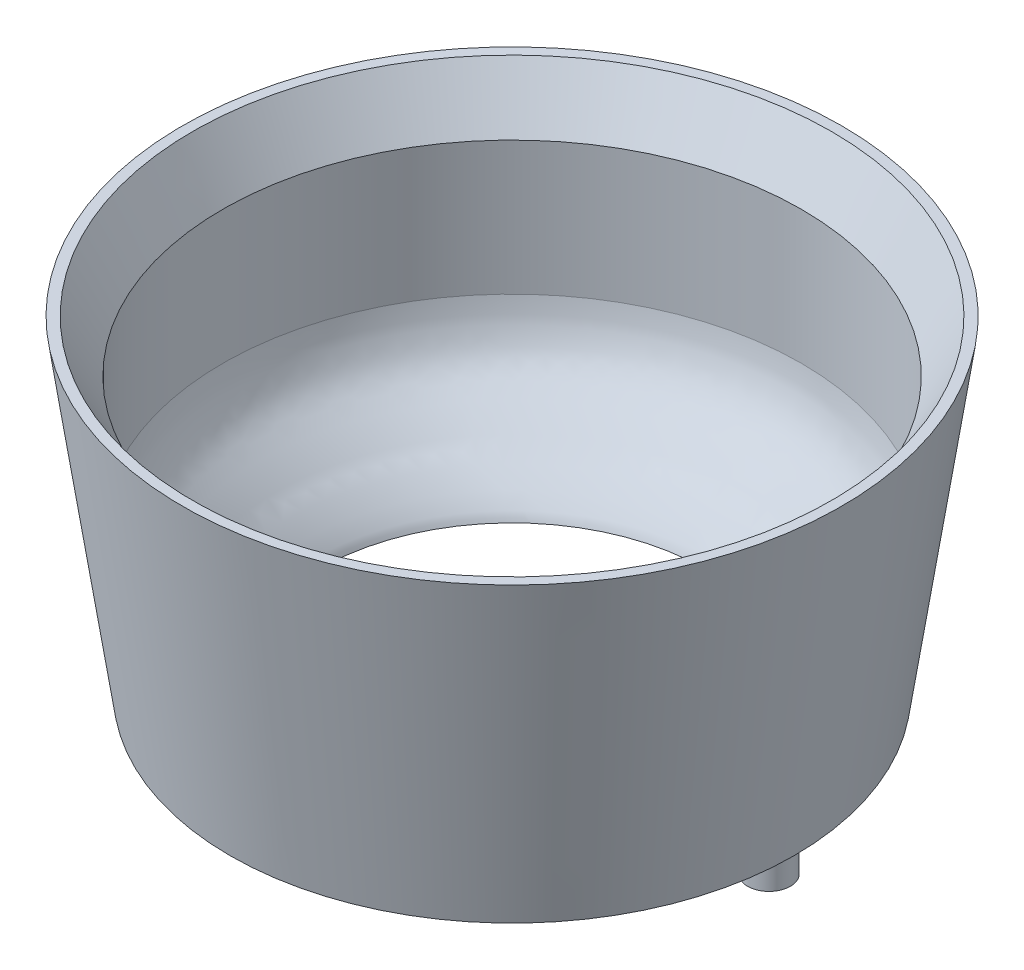
ISO-10303-21;
HEADER;
FILE_DESCRIPTION(('STEP AP214'),'2;1');
FILE_NAME('part.step','',(''),(''),'','','');
FILE_SCHEMA(('AUTOMOTIVE_DESIGN { 1 0 10303 214 1 1 1 1 }'));
ENDSEC;
DATA;
#1=APPLICATION_CONTEXT('core data for automotive mechanical design processes');
#2=APPLICATION_PROTOCOL_DEFINITION('international standard','automotive_design',2000,#1);
#3=PRODUCT_CONTEXT('',#1,'mechanical');
#4=PRODUCT('Part','Part','',(#3));
#5=PRODUCT_RELATED_PRODUCT_CATEGORY('part','',(#4));
#6=PRODUCT_DEFINITION_FORMATION('','',#4);
#7=PRODUCT_DEFINITION_CONTEXT('part definition',#1,'design');
#8=PRODUCT_DEFINITION('design','',#6,#7);
#9=PRODUCT_DEFINITION_SHAPE('','',#8);
#10=(LENGTH_UNIT() NAMED_UNIT(*) SI_UNIT(.MILLI.,.METRE.));
#11=(NAMED_UNIT(*) PLANE_ANGLE_UNIT() SI_UNIT($,.RADIAN.));
#12=(NAMED_UNIT(*) SI_UNIT($,.STERADIAN.) SOLID_ANGLE_UNIT());
#13=UNCERTAINTY_MEASURE_WITH_UNIT(LENGTH_MEASURE(1.E-05),#10,'distance_accuracy_value','');
#14=(GEOMETRIC_REPRESENTATION_CONTEXT(3) GLOBAL_UNCERTAINTY_ASSIGNED_CONTEXT((#13)) GLOBAL_UNIT_ASSIGNED_CONTEXT((#10,
#11,#12)) REPRESENTATION_CONTEXT('',''));
#15=CARTESIAN_POINT('',(0.,0.,0.));
#16=DIRECTION('',(0.,0.,1.));
#17=DIRECTION('',(1.,0.,0.));
#18=AXIS2_PLACEMENT_3D('',#15,#16,#17);
#19=CARTESIAN_POINT('',(0.,295.540718437762,-40.5476747547934));
#20=CARTESIAN_POINT('',(0.,295.012709615636,-40.4477404657415));
#21=CARTESIAN_POINT('',(0.,293.970757618623,-40.2927773525862));
#22=CARTESIAN_POINT('',(0.,292.587532752845,-39.930889754875));
#23=CARTESIAN_POINT('',(0.,291.581451359409,-39.51618641559));
#24=CARTESIAN_POINT('',(0.,290.578047280025,-39.1083707824325));
#25=CARTESIAN_POINT('',(0.,289.316986818185,-38.4396980542591));
#26=CARTESIAN_POINT('',(0.,288.032583078736,-37.3314160861705));
#27=CARTESIAN_POINT('',(0.,287.115418473763,-36.3683638812662));
#28=CARTESIAN_POINT('',(0.,286.340079672536,-35.6302312643945));
#29=CARTESIAN_POINT('',(0.,285.762737125999,-35.0164727262729));
#30=CARTESIAN_POINT('',(0.,285.247169223289,-34.3942597952709));
#31=CARTESIAN_POINT('',(0.,284.556557999368,-33.6355246615368));
#32=CARTESIAN_POINT('',(0.,283.771384037677,-32.9203613336381));
#33=CARTESIAN_POINT('',(0.,282.986073935963,-32.12965190107));
#34=CARTESIAN_POINT('',(0.,282.459482322822,-31.4852417836461));
#35=CARTESIAN_POINT('',(0.,281.963476572773,-30.9149972084707));
#36=CARTESIAN_POINT('',(0.,281.391298158875,-30.3717003462487));
#37=CARTESIAN_POINT('',(0.,280.804626849955,-29.7827961587849));
#38=CARTESIAN_POINT('',(0.,280.262154528045,-29.2275845813112));
#39=CARTESIAN_POINT('',(0.,279.674853681479,-28.7247526180959));
#40=CARTESIAN_POINT('',(0.,279.039651715273,-28.1803862534295));
#41=CARTESIAN_POINT('',(0.,278.470209991792,-27.651838315325));
#42=CARTESIAN_POINT('',(0.,277.876839186641,-27.3081459354535));
#43=CARTESIAN_POINT('',(0.,277.127164256162,-26.9952300805427));
#44=CARTESIAN_POINT('',(0.,276.164510632259,-26.5979526177344));
#45=CARTESIAN_POINT('',(0.,275.470548140668,-26.4648115829165));
#46=CARTESIAN_POINT('',(0.,274.996982716808,-26.5077562004189));
#47=B_SPLINE_CURVE_WITH_KNOTS('',3,(#19,#20,#21,#22,#23,#24,#25,#26,#27,#28,#29,#30,#31,#32,#33,
#34,#35,#36,#37,#38,#39,#40,#41,#42,#43,#44,#45,#46),.UNSPECIFIED.,.F.,.F.,(4,1,1,1,1,1,1,1,1,1,
1,1,1,1,1,1,1,1,1,1,1,1,1,1,1,4),(0.,0.0625440482121128,0.125088096424226,0.156360120530282,
0.187632144636338,0.250176192848451,0.312720241060564,0.375264289272677,0.406536313378733,
0.43780833748479,0.469080361590846,0.500352385696902,0.562896433909015,0.594168458015071,
0.625440482121128,0.656712506227184,0.687984530333241,0.719256554439297,0.750528578545353,
0.78180060265141,0.813072626757466,0.844344650863523,0.875616674969579,0.906888699075636,
0.938160723181692,1.0007047713938),.UNSPECIFIED.);
#48=CARTESIAN_POINT('',(0.,5.,0.));
#49=DIRECTION('',(0.,-1.,0.));
#50=AXIS1_PLACEMENT('',#48,#49);
#51=SURFACE_OF_REVOLUTION('',#47,#50);
#52=CARTESIAN_POINT('',(0.,277.310263696253,8.72200439426112E-13));
#53=DIRECTION('',(0.,-1.,0.));
#54=DIRECTION('',(0.,0.,-1.));
#55=AXIS2_PLACEMENT_3D('',#52,#53,#54);
#56=CIRCLE('',#55,27.0721300064564);
#57=CARTESIAN_POINT('',(0.,277.310263696253,-27.0721300064555));
#58=VERTEX_POINT('',#57);
#59=EDGE_CURVE('E63',#58,#58,#56,.F.);
#60=ORIENTED_EDGE('',*,*,#59,.F.);
#61=EDGE_LOOP('',(#60));
#62=FACE_BOUND('',#61,.T.);
#63=CARTESIAN_POINT('',(0.,295.540718437762,9.30591960996588E-13));
#64=DIRECTION('',(0.,-1.,0.));
#65=DIRECTION('',(0.,0.,-1.));
#66=AXIS2_PLACEMENT_3D('',#63,#64,#65);
#67=CIRCLE('',#66,40.5476747547944);
#68=CARTESIAN_POINT('',(0.,295.540718437762,-40.5476747547934));
#69=VERTEX_POINT('',#68);
#70=EDGE_CURVE('E52',#69,#69,#67,.T.);
#71=ORIENTED_EDGE('',*,*,#70,.F.);
#72=EDGE_LOOP('',(#71));
#73=FACE_BOUND('',#72,.T.);
#74=ADVANCED_FACE('F32',(#62,#73),#51,.F.);
#75=CARTESIAN_POINT('',(0.,5.,0.));
#76=DIRECTION('',(0.,-1.,0.));
#77=DIRECTION('',(0.,0.,-1.));
#78=AXIS2_PLACEMENT_3D('',#75,#76,#77);
#79=CYLINDRICAL_SURFACE('',#78,40.5476747547944);
#80=ORIENTED_EDGE('',*,*,#70,.T.);
#81=EDGE_LOOP('',(#80));
#82=FACE_BOUND('',#81,.T.);
#83=CARTESIAN_POINT('',(0.,314.238618936809,9.90480695303734E-13));
#84=DIRECTION('',(0.,-1.,0.));
#85=DIRECTION('',(0.,0.,-1.));
#86=AXIS2_PLACEMENT_3D('',#83,#84,#85);
#87=CIRCLE('',#86,40.5476747547944);
#88=CARTESIAN_POINT('',(0.,314.238618936809,-40.5476747547934));
#89=VERTEX_POINT('',#88);
#90=EDGE_CURVE('E67',#89,#89,#87,.T.);
#91=ORIENTED_EDGE('',*,*,#90,.F.);
#92=EDGE_LOOP('',(#91));
#93=FACE_BOUND('',#92,.T.);
#94=ADVANCED_FACE('F87',(#82,#93),#79,.F.);
#95=CARTESIAN_POINT('',(0.,321.561079724369,1.01393428618166E-12));
#96=DIRECTION('',(0.,1.,0.));
#97=DIRECTION('',(0.,0.,1.));
#98=AXIS2_PLACEMENT_3D('',#95,#96,#97);
#99=CONICAL_SURFACE('',#98,44.775299461623,0.523598775598309);
#100=ORIENTED_EDGE('',*,*,#90,.T.);
#101=EDGE_LOOP('',(#100));
#102=FACE_BOUND('',#101,.T.);
#103=CARTESIAN_POINT('',(0.,321.561079724369,1.01393428618166E-12));
#104=DIRECTION('',(0.,-1.,0.));
#105=DIRECTION('',(0.,0.,-1.));
#106=AXIS2_PLACEMENT_3D('',#103,#104,#105);
#107=CIRCLE('',#106,44.775299461623);
#108=CARTESIAN_POINT('',(0.,321.561079724369,-44.775299461622));
#109=VERTEX_POINT('',#108);
#110=EDGE_CURVE('E70',#109,#109,#107,.T.);
#111=ORIENTED_EDGE('',*,*,#110,.F.);
#112=EDGE_LOOP('',(#111));
#113=FACE_BOUND('',#112,.T.);
#114=ADVANCED_FACE('F171',(#102,#113),#99,.F.);
#115=CARTESIAN_POINT('',(0.,321.561079724369,-44.775299461622));
#116=DIRECTION('',(0.,1.,0.));
#117=DIRECTION('',(0.,0.,1.));
#118=AXIS2_PLACEMENT_3D('',#115,#116,#117);
#119=PLANE('',#118);
#120=ORIENTED_EDGE('',*,*,#110,.T.);
#121=EDGE_LOOP('',(#120));
#122=FACE_BOUND('',#121,.T.);
#123=CARTESIAN_POINT('',(0.,321.561079724369,1.01393428618166E-12));
#124=DIRECTION('',(0.,-1.,0.));
#125=DIRECTION('',(0.,0.,-1.));
#126=AXIS2_PLACEMENT_3D('',#123,#124,#125);
#127=CIRCLE('',#126,46.181267187361);
#128=CARTESIAN_POINT('',(0.,321.561079724369,-46.1812671873599));
#129=VERTEX_POINT('',#128);
#130=EDGE_CURVE('E73',#129,#129,#127,.T.);
#131=ORIENTED_EDGE('',*,*,#130,.F.);
#132=EDGE_LOOP('',(#131));
#133=FACE_BOUND('',#132,.T.);
#134=ADVANCED_FACE('F166',(#122,#133),#119,.T.);
#135=CARTESIAN_POINT('',(0.,273.84861893681,8.61112909931847E-13));
#136=DIRECTION('',(0.,1.,0.));
#137=DIRECTION('',(0.,0.,1.));
#138=AXIS2_PLACEMENT_3D('',#135,#136,#137);
#139=CONICAL_SURFACE('',#138,39.2207719119618,0.144862327915536);
#140=CARTESIAN_POINT('',(0.,275.814076868609,8.83813802438512E-13));
#141=DIRECTION('',(0.,-1.,0.));
#142=DIRECTION('',(0.,0.,-1.));
#143=AXIS2_PLACEMENT_3D('',#140,#141,#142);
#144=CIRCLE('',#143,39.5075012154281);
#145=CARTESIAN_POINT('',(0.,275.814076868609,-39.5075012154272));
#146=VERTEX_POINT('',#145);
#147=EDGE_CURVE('E60',#146,#146,#144,.T.);
#148=ORIENTED_EDGE('',*,*,#147,.F.);
#149=EDGE_LOOP('',(#148));
#150=FACE_BOUND('',#149,.T.);
#151=ORIENTED_EDGE('',*,*,#130,.T.);
#152=EDGE_LOOP('',(#151));
#153=FACE_BOUND('',#152,.T.);
#154=ADVANCED_FACE('F157',(#150,#153),#139,.T.);
#155=CARTESIAN_POINT('',(0.,-0.122002410112787,0.));
#156=DIRECTION('',(0.,-1.,0.));
#157=DIRECTION('',(0.,0.,-1.));
#158=AXIS2_PLACEMENT_3D('',#155,#156,#157);
#159=SPHERICAL_SURFACE('',#158,278.75);
#160=CARTESIAN_POINT('',(33.8781161629027,276.553507119057,-2.12075811374682));
#161=CARTESIAN_POINT('',(33.997950181285,276.53791447458,-2.24064512918627));
#162=CARTESIAN_POINT('',(34.1279762640728,276.520995585966,-2.35035744651461));
#163=CARTESIAN_POINT('',(34.4045861326565,276.484998252348,-2.54626144829136));
#164=CARTESIAN_POINT('',(34.5511913314112,276.465917014468,-2.63242221243267));
#165=CARTESIAN_POINT('',(34.8565401580757,276.426170520159,-2.77869079755125));
#166=CARTESIAN_POINT('',(35.0152742168612,276.405506512435,-2.83881891245856));
#167=CARTESIAN_POINT('',(35.3404223211753,276.363173601888,-2.9314727719979));
#168=CARTESIAN_POINT('',(35.5068344045577,276.341504955796,-2.96400552797592));
#169=CARTESIAN_POINT('',(35.843517753209,276.297659880331,-3.00072064481872));
#170=CARTESIAN_POINT('',(36.0138037263799,276.275481510461,-3.00476594643728));
#171=CARTESIAN_POINT('',(36.3526507350395,276.231344114294,-2.9840328586594));
#172=CARTESIAN_POINT('',(36.5212116633068,276.209385101633,-2.95925268844249));
#173=CARTESIAN_POINT('',(36.852151342064,276.166267462159,-2.88145567281949));
#174=CARTESIAN_POINT('',(37.0145173570621,276.145110484688,-2.82838369848728));
#175=CARTESIAN_POINT('',(37.3280644861016,276.104249555354,-2.69541122059634));
#176=CARTESIAN_POINT('',(37.4792457465309,276.084545584472,-2.61551106824485));
#177=CARTESIAN_POINT('',(37.7655452399225,276.047227574344,-2.43140202794787));
#178=CARTESIAN_POINT('',(37.9007171052462,276.029606557492,-2.32727797990586));
#179=CARTESIAN_POINT('',(38.1516449239497,275.996892875266,-2.09746630474723));
#180=CARTESIAN_POINT('',(38.2674016412406,275.981800110415,-1.97177952643466));
#181=CARTESIAN_POINT('',(38.4752872943857,275.954693451249,-1.70339437800904));
#182=CARTESIAN_POINT('',(38.5675844921912,275.942657631668,-1.56082856550733));
#183=CARTESIAN_POINT('',(38.7269099053516,275.921880143494,-1.26199432562755));
#184=CARTESIAN_POINT('',(38.7939392746772,275.913138324465,-1.10572652441514));
#185=CARTESIAN_POINT('',(38.9002778229572,275.899269496208,-0.785276774101896));
#186=CARTESIAN_POINT('',(38.9398056328697,275.894113976801,-0.621168592751014));
#187=CARTESIAN_POINT('',(38.9908231942126,275.887459821347,-0.288579567760792));
#188=CARTESIAN_POINT('',(39.0023139336703,275.885961056437,-0.12009887842028));
#189=CARTESIAN_POINT('',(38.9969270810237,275.886663668032,0.21553457140004));
#190=CARTESIAN_POINT('',(38.9801942747743,275.888846159814,0.382689716483161));
#191=CARTESIAN_POINT('',(38.9191371957418,275.896809697984,0.711791074114438));
#192=CARTESIAN_POINT('',(38.8748131374082,275.902590716403,0.873737327137774));
#193=CARTESIAN_POINT('',(38.7598857265348,275.917579504274,1.18785640414194));
#194=CARTESIAN_POINT('',(38.6892809540829,275.92678745888,1.3400286995278));
#195=CARTESIAN_POINT('',(38.5238652007594,275.948358768698,1.63034285439368));
#196=CARTESIAN_POINT('',(38.4290537081502,275.960722190618,1.76848441717333));
#197=CARTESIAN_POINT('',(38.2174214746739,275.988316746204,2.02760160825753));
#198=CARTESIAN_POINT('',(38.1004897102566,276.003562345506,2.1484849997043));
#199=CARTESIAN_POINT('',(37.8483023704294,276.036439429083,2.36893031259495));
#200=CARTESIAN_POINT('',(37.7130460504468,276.054071010308,2.46849136723427));
#201=CARTESIAN_POINT('',(37.4268931807155,276.091368991438,2.64431445672775));
#202=CARTESIAN_POINT('',(37.2758801744502,276.111050540311,2.72038374398697));
#203=CARTESIAN_POINT('',(36.9633981862069,276.15177167068,2.84609022287851));
#204=CARTESIAN_POINT('',(36.8019287566157,276.172811310313,2.89572628213111));
#205=CARTESIAN_POINT('',(36.4718386958465,276.215817258829,2.96750814888479));
#206=CARTESIAN_POINT('',(36.3031740976157,276.237789258749,2.98944846062903));
#207=CARTESIAN_POINT('',(35.9645790529441,276.281892812953,3.00457424957875));
#208=CARTESIAN_POINT('',(35.7946485718972,276.304024371599,2.99775893777385));
#209=CARTESIAN_POINT('',(35.4577113024547,276.34790150228,2.95547838280096));
#210=CARTESIAN_POINT('',(35.290717037053,276.369645424843,2.91991150208955));
#211=CARTESIAN_POINT('',(34.9650356725739,276.412046815976,2.8209596330301));
#212=CARTESIAN_POINT('',(34.8063485517652,276.432704287388,2.75757471745731));
#213=CARTESIAN_POINT('',(34.5021281546121,276.472302781842,2.6048596607806));
#214=CARTESIAN_POINT('',(34.3565710568169,276.491246913522,2.51557779766454));
#215=CARTESIAN_POINT('',(34.0825117923757,276.526912226307,2.31348723039819));
#216=CARTESIAN_POINT('',(33.9540091365656,276.54363347117,2.20067920127587));
#217=CARTESIAN_POINT('',(33.7186155859323,276.574261408938,1.95549986272156));
#218=CARTESIAN_POINT('',(33.6115903453407,276.588185598601,1.82325974132654));
#219=CARTESIAN_POINT('',(33.4212916122314,276.612942361428,1.54241082379527));
#220=CARTESIAN_POINT('',(33.338017075344,276.623775070531,1.39380274779177));
#221=CARTESIAN_POINT('',(33.1982988291528,276.641949481501,1.08574519716588));
#222=CARTESIAN_POINT('',(33.1416408658794,276.649319060491,0.926394531289785));
#223=CARTESIAN_POINT('',(33.0558514733229,276.660477572429,0.600335584691386));
#224=CARTESIAN_POINT('',(33.0267178329563,276.664266792994,0.433627896099676));
#225=CARTESIAN_POINT('',(32.9969456932488,276.668139058533,0.0987286405219057));
#226=CARTESIAN_POINT('',(32.9961254101758,276.668245746922,-0.0694465229822107));
#227=CARTESIAN_POINT('',(33.0225501274298,276.664808858722,-0.403583787399967));
#228=CARTESIAN_POINT('',(33.0498017174229,276.661264425059,-0.569545359423634));
#229=CARTESIAN_POINT('',(33.1315043126971,276.650637535279,-0.89428539950482));
#230=CARTESIAN_POINT('',(33.1859233713982,276.643559234682,-1.05307206603101));
#231=CARTESIAN_POINT('',(33.3203062560289,276.626078897076,-1.35908199292226));
#232=CARTESIAN_POINT('',(33.4002393040496,276.615680864707,-1.50631892067928));
#233=CARTESIAN_POINT('',(33.5478370180147,276.596479678437,-1.73130004976796));
#234=CARTESIAN_POINT('',(33.6083235499667,276.588610690359,-1.81392713335854));
#235=CARTESIAN_POINT('',(33.7373442361448,276.571824152527,-1.97252128735713));
#236=CARTESIAN_POINT('',(33.8058783706682,276.562906605341,-2.04848837406986));
#237=CARTESIAN_POINT('',(33.8781161629027,276.553507119057,-2.12075811374682));
#238=B_SPLINE_CURVE_WITH_KNOTS('',3,(#160,#161,#162,#163,#164,#165,#166,#167,#168,#169,#170,
#171,#172,#173,#174,#175,#176,#177,#178,#179,#180,#181,#182,#183,#184,#185,#186,#187,#188,#189,
#190,#191,#192,#193,#194,#195,#196,#197,#198,#199,#200,#201,#202,#203,#204,#205,#206,#207,#208,
#209,#210,#211,#212,#213,#214,#215,#216,#217,#218,#219,#220,#221,#222,#223,#224,#225,#226,#227,
#228,#229,#230,#231,#232,#233,#234,#235,#236,#237),.UNSPECIFIED.,.T.,.F.,(4,2,2,2,2,2,2,2,2,2,2,
2,2,2,2,2,2,2,2,2,2,2,2,2,2,2,2,2,2,2,2,2,2,2,2,2,2,2,4),(0.,0.510294111171256,1.02125499292433,
1.5318168312592,2.04224890868486,2.55513511667088,3.06805301214408,3.58197404372416,
4.09588834783478,4.60802915654578,5.1201498097622,5.62848649037321,6.13679995265789,
6.64102479053677,7.14523185925523,7.6468602216153,8.14848468517962,8.65013625478439,
9.15179843033791,9.65604871141994,10.160319487606,10.6686240963293,11.1769504786907,
11.6890267662037,12.2011171043991,12.7150256529335,13.2289328570307,13.7418881081779,
14.2548286433057,14.7644531037629,15.2740551514761,15.7794816529439,16.2848675490429,
16.7870080461891,17.2892664439974,17.7909356158879,18.2920018894082,18.5996157934303,
18.9072289443445),.UNSPECIFIED.);
#239=CARTESIAN_POINT('',(33.8781161629027,276.553507119057,-2.12075811374682));
#240=VERTEX_POINT('',#239);
#241=EDGE_CURVE('E115',#240,#240,#238,.T.);
#242=ORIENTED_EDGE('',*,*,#241,.F.);
#243=EDGE_LOOP('',(#242));
#244=FACE_BOUND('',#243,.T.);
#245=CARTESIAN_POINT('',(-33.2642370627931,276.182145393172,15.8452181850259));
#246=CARTESIAN_POINT('',(-33.1421863302758,276.203618509257,15.7269989165419));
#247=CARTESIAN_POINT('',(-33.0100193594641,276.225556716465,15.6191235133551));
#248=CARTESIAN_POINT('',(-32.7292554621488,276.269728346355,15.4272154965331));
#249=CARTESIAN_POINT('',(-32.5806381724577,276.291962104258,15.3432129032482));
#250=CARTESIAN_POINT('',(-32.2713419875582,276.336067142499,15.2015839692227));
#251=CARTESIAN_POINT('',(-32.1106686971638,276.357938585573,15.1439454592232));
#252=CARTESIAN_POINT('',(-31.7818064673342,276.400699371081,15.0566952482865));
#253=CARTESIAN_POINT('',(-31.6136195309345,276.421588972248,15.0270761239044));
#254=CARTESIAN_POINT('',(-31.2746498336266,276.461773123686,14.9967734754174));
#255=CARTESIAN_POINT('',(-31.1038700427139,276.481069356695,14.9960590250498));
#256=CARTESIAN_POINT('',(-30.7644247653763,276.517533597244,15.0236185356458));
#257=CARTESIAN_POINT('',(-30.5957593111229,276.534701572435,15.0518929371599));
#258=CARTESIAN_POINT('',(-30.2664572585216,276.566306390227,15.1364727627929));
#259=CARTESIAN_POINT('',(-30.1057776053418,276.580759403965,15.1926044563175));
#260=CARTESIAN_POINT('',(-29.796005831677,276.606637812792,15.3313137143124));
#261=CARTESIAN_POINT('',(-29.6469131540935,276.618063353503,15.4138900063552));
#262=CARTESIAN_POINT('',(-29.3658476710061,276.637464970608,15.6024100746608));
#263=CARTESIAN_POINT('',(-29.2337444730557,276.645468572023,15.708156627023));
#264=CARTESIAN_POINT('',(-28.9890830344555,276.657922521837,15.9404268139137));
#265=CARTESIAN_POINT('',(-28.8765239440031,276.66237302476,16.0669495446018));
#266=CARTESIAN_POINT('',(-28.674902374834,276.667569869582,16.3362561857216));
#267=CARTESIAN_POINT('',(-28.5856891630505,276.668340557588,16.4789268059076));
#268=CARTESIAN_POINT('',(-28.4323366352959,276.666221013031,16.7771337961128));
#269=CARTESIAN_POINT('',(-28.3681968544598,276.663330848345,16.9326699275388));
#270=CARTESIAN_POINT('',(-28.2668977433285,276.653985862653,17.2518201904836));
#271=CARTESIAN_POINT('',(-28.229680976144,276.647538682237,17.4154163252576));
#272=CARTESIAN_POINT('',(-28.1829890704065,276.631274983242,17.7463537369339));
#273=CARTESIAN_POINT('',(-28.173514195803,276.621458432606,17.9136950494543));
#274=CARTESIAN_POINT('',(-28.18249282401,276.598704962758,18.2479555558425));
#275=CARTESIAN_POINT('',(-28.2010370085621,276.5857580263,18.4148716202844));
#276=CARTESIAN_POINT('',(-28.2655864227708,276.557134743562,18.7430617711724));
#277=CARTESIAN_POINT('',(-28.3115925978552,276.541458303327,18.9043356631742));
#278=CARTESIAN_POINT('',(-28.4300991439213,276.507700575884,19.2179074920339));
#279=CARTESIAN_POINT('',(-28.5027876816135,276.489602803868,19.370132531901));
#280=CARTESIAN_POINT('',(-28.6724735763884,276.45160441905,19.6601208223855));
#281=CARTESIAN_POINT('',(-28.769472004942,276.431703726808,19.7978834351841));
#282=CARTESIAN_POINT('',(-28.9858754704435,276.390491625566,20.0562012545221));
#283=CARTESIAN_POINT('',(-29.1054543794819,276.369170161178,20.1766092147549));
#284=CARTESIAN_POINT('',(-29.3630946742813,276.325862372152,20.3955455481939));
#285=CARTESIAN_POINT('',(-29.5011567173353,276.30387602389,20.4940731429641));
#286=CARTESIAN_POINT('',(-29.7926698944855,276.259735328923,20.6669718831826));
#287=CARTESIAN_POINT('',(-29.9462003416439,276.237580717343,20.7412092789966));
#288=CARTESIAN_POINT('',(-30.2636787970499,276.193850470279,20.8626714015181));
#289=CARTESIAN_POINT('',(-30.4276269193525,276.172274841137,20.909895832425));
#290=CARTESIAN_POINT('',(-30.761368934104,276.130309171207,20.9759485059874));
#291=CARTESIAN_POINT('',(-30.9311651872677,276.109919618348,20.9947651405413));
#292=CARTESIAN_POINT('',(-31.2716969859134,276.070924293079,21.0033353083848));
#293=CARTESIAN_POINT('',(-31.4424325133325,276.052318486493,20.9930893986302));
#294=CARTESIAN_POINT('',(-31.779107408751,276.017519731266,20.9438356098809));
#295=CARTESIAN_POINT('',(-31.9450659570253,276.001315564068,20.9049668709358));
#296=CARTESIAN_POINT('',(-32.2682416878576,275.971691622813,20.7996224603917));
#297=CARTESIAN_POINT('',(-32.4254592482124,275.958271728349,20.7331479830016));
#298=CARTESIAN_POINT('',(-32.7253517801757,275.934712942665,20.5750432108344));
#299=CARTESIAN_POINT('',(-32.8681325202999,275.924548792336,20.483617305296));
#300=CARTESIAN_POINT('',(-33.1364035211925,275.907661626683,20.2779306180922));
#301=CARTESIAN_POINT('',(-33.2618945385883,275.900938460741,20.1636708362124));
#302=CARTESIAN_POINT('',(-33.4910417832416,275.891173998803,19.9165077148862));
#303=CARTESIAN_POINT('',(-33.594855561162,275.888105314626,19.783751495506));
#304=CARTESIAN_POINT('',(-33.7788387378029,275.885650247964,19.5027288570954));
#305=CARTESIAN_POINT('',(-33.8590087461008,275.886263770536,19.354462838068));
#306=CARTESIAN_POINT('',(-33.9931643266133,275.891145156326,19.0472477275288));
#307=CARTESIAN_POINT('',(-34.0472470972463,275.895399287948,18.8883408443955));
#308=CARTESIAN_POINT('',(-34.128185609738,275.907416276491,18.5638750909184));
#309=CARTESIAN_POINT('',(-34.1550424173079,275.915178996057,18.3983164812082));
#310=CARTESIAN_POINT('',(-34.1808734413154,275.933997699306,18.0649736587118));
#311=CARTESIAN_POINT('',(-34.17980512487,275.945058681256,17.8971864400176));
#312=CARTESIAN_POINT('',(-34.1498089847342,275.970149564697,17.5643034014663));
#313=CARTESIAN_POINT('',(-34.120873465437,275.984180285454,17.3992083378628));
#314=CARTESIAN_POINT('',(-34.03577978391,276.014905696866,17.0752645389894));
#315=CARTESIAN_POINT('',(-33.9794390437906,276.031617743271,16.9164655338864));
#316=CARTESIAN_POINT('',(-33.8411782940846,276.067145796522,16.6108383341345));
#317=CARTESIAN_POINT('',(-33.7592877850362,276.085959360891,16.4639965786107));
#318=CARTESIAN_POINT('',(-33.607489194003,276.117793775551,16.2383893653182));
#319=CARTESIAN_POINT('',(-33.5446018595277,276.130341521337,16.1547434757564));
#320=CARTESIAN_POINT('',(-33.4104968091147,276.155916035003,15.9945010005282));
#321=CARTESIAN_POINT('',(-33.3392790645452,276.16894280453,15.917904439092));
#322=CARTESIAN_POINT('',(-33.2642370627931,276.182145393172,15.8452181850259));
#323=B_SPLINE_CURVE_WITH_KNOTS('',3,(#245,#246,#247,#248,#249,#250,#251,#252,#253,#254,#255,
#256,#257,#258,#259,#260,#261,#262,#263,#264,#265,#266,#267,#268,#269,#270,#271,#272,#273,#274,
#275,#276,#277,#278,#279,#280,#281,#282,#283,#284,#285,#286,#287,#288,#289,#290,#291,#292,#293,
#294,#295,#296,#297,#298,#299,#300,#301,#302,#303,#304,#305,#306,#307,#308,#309,#310,#311,#312,
#313,#314,#315,#316,#317,#318,#319,#320,#321,#322),.UNSPECIFIED.,.T.,.F.,(4,2,2,2,2,2,2,2,2,2,2,
2,2,2,2,2,2,2,2,2,2,2,2,2,2,2,2,2,2,2,2,2,2,2,2,2,2,2,4),(0.,0.513424131099277,1.02749107097157,
1.54132048533431,2.05501372777854,2.56815733479891,3.0813087403006,3.59129937533463,
4.10126547497396,4.60704865409962,5.11280983561969,5.61522015847998,6.11762116613789,
6.61894717748832,7.12027795867629,7.62323474125178,8.12620884000711,8.63280033075538,
9.13941415371034,9.65010098394175,10.1608059799282,10.6742775249174,11.1877546924746,
11.7014416222866,12.2151187078483,12.7263150763735,13.2374893331324,13.7445958712523,
14.2516802104788,14.7549398443271,15.2581865021342,15.7595433455954,16.26088056359,
16.7629814150062,17.265220962761,17.7708533120826,18.2759039901249,18.5915779834288,
18.9072530617416),.UNSPECIFIED.);
#324=CARTESIAN_POINT('',(-33.2642370627931,276.182145393172,15.8452181850259));
#325=VERTEX_POINT('',#324);
#326=EDGE_CURVE('E64',#325,#325,#323,.T.);
#327=ORIENTED_EDGE('',*,*,#326,.F.);
#328=EDGE_LOOP('',(#327));
#329=FACE_BOUND('',#328,.T.);
#330=ORIENTED_EDGE('',*,*,#59,.T.);
#331=EDGE_LOOP('',(#330));
#332=FACE_BOUND('',#331,.T.);
#333=ORIENTED_EDGE('',*,*,#147,.T.);
#334=EDGE_LOOP('',(#333));
#335=FACE_BOUND('',#334,.T.);
#336=ADVANCED_FACE('F141',(#244,#329,#332,#335),#159,.F.);
#337=CARTESIAN_POINT('',(-31.1769145362399,321.563079724369,18.0000000000008));
#338=DIRECTION('',(0.,-1.,0.));
#339=DIRECTION('',(0.,0.,-1.));
#340=AXIS2_PLACEMENT_3D('',#337,#338,#339);
#341=CYLINDRICAL_SURFACE('',#340,3.);
#342=ORIENTED_EDGE('',*,*,#326,.T.);
#343=EDGE_LOOP('',(#342));
#344=FACE_BOUND('',#343,.T.);
#345=CARTESIAN_POINT('',(-31.1769145362399,271.84861893681,18.0000000000007));
#346=DIRECTION('',(0.,-1.,0.));
#347=DIRECTION('',(0.,0.,-1.));
#348=AXIS2_PLACEMENT_3D('',#345,#346,#347);
#349=CIRCLE('',#348,3.);
#350=CARTESIAN_POINT('',(-31.1769145362399,271.84861893681,15.0000000000007));
#351=VERTEX_POINT('',#350);
#352=EDGE_CURVE('E119',#351,#351,#349,.T.);
#353=ORIENTED_EDGE('',*,*,#352,.F.);
#354=EDGE_LOOP('',(#353));
#355=FACE_BOUND('',#354,.T.);
#356=ADVANCED_FACE('F136',(#344,#355),#341,.T.);
#357=CARTESIAN_POINT('',(-31.1769145362399,271.84861893681,18.0000000000007));
#358=DIRECTION('',(0.,-1.,0.));
#359=DIRECTION('',(0.,0.,-1.));
#360=AXIS2_PLACEMENT_3D('',#357,#358,#359);
#361=PLANE('',#360);
#362=CARTESIAN_POINT('',(-31.1769145362399,271.84861893681,18.0000000000007));
#363=DIRECTION('',(0.,-1.,0.));
#364=DIRECTION('',(0.,0.,-1.));
#365=AXIS2_PLACEMENT_3D('',#362,#363,#364);
#366=CIRCLE('',#365,2.55);
#367=CARTESIAN_POINT('',(-31.1769145362399,271.84861893681,15.4500000000007));
#368=VERTEX_POINT('',#367);
#369=EDGE_CURVE('E43',#368,#368,#366,.F.);
#370=ORIENTED_EDGE('',*,*,#369,.T.);
#371=EDGE_LOOP('',(#370));
#372=FACE_BOUND('',#371,.T.);
#373=ORIENTED_EDGE('',*,*,#352,.T.);
#374=EDGE_LOOP('',(#373));
#375=FACE_BOUND('',#374,.T.);
#376=ADVANCED_FACE('F133',(#372,#375),#361,.T.);
#377=CARTESIAN_POINT('',(36.,321.563079724369,1.0299555207058E-12));
#378=DIRECTION('',(0.,-1.,0.));
#379=DIRECTION('',(0.,0.,-1.));
#380=AXIS2_PLACEMENT_3D('',#377,#378,#379);
#381=CYLINDRICAL_SURFACE('',#380,3.);
#382=ORIENTED_EDGE('',*,*,#241,.T.);
#383=EDGE_LOOP('',(#382));
#384=FACE_BOUND('',#383,.T.);
#385=CARTESIAN_POINT('',(36.,271.84861893681,8.70721807087471E-13));
#386=DIRECTION('',(0.,-1.,0.));
#387=DIRECTION('',(0.,0.,-1.));
#388=AXIS2_PLACEMENT_3D('',#385,#386,#387);
#389=CIRCLE('',#388,3.);
#390=CARTESIAN_POINT('',(36.,271.84861893681,-2.99999999999913));
#391=VERTEX_POINT('',#390);
#392=EDGE_CURVE('E113',#391,#391,#389,.T.);
#393=ORIENTED_EDGE('',*,*,#392,.F.);
#394=EDGE_LOOP('',(#393));
#395=FACE_BOUND('',#394,.T.);
#396=ADVANCED_FACE('F109',(#384,#395),#381,.T.);
#397=CARTESIAN_POINT('',(36.,271.84861893681,8.70721807087471E-13));
#398=DIRECTION('',(0.,-1.,0.));
#399=DIRECTION('',(0.,0.,-1.));
#400=AXIS2_PLACEMENT_3D('',#397,#398,#399);
#401=PLANE('',#400);
#402=CARTESIAN_POINT('',(36.,271.84861893681,8.70721807087471E-13));
#403=DIRECTION('',(0.,-1.,0.));
#404=DIRECTION('',(0.,0.,-1.));
#405=AXIS2_PLACEMENT_3D('',#402,#403,#404);
#406=CIRCLE('',#405,2.55000000000001);
#407=CARTESIAN_POINT('',(36.,271.84861893681,-2.54999999999914));
#408=VERTEX_POINT('',#407);
#409=EDGE_CURVE('E47',#408,#408,#406,.F.);
#410=ORIENTED_EDGE('',*,*,#409,.T.);
#411=EDGE_LOOP('',(#410));
#412=FACE_BOUND('',#411,.T.);
#413=ORIENTED_EDGE('',*,*,#392,.T.);
#414=EDGE_LOOP('',(#413));
#415=FACE_BOUND('',#414,.T.);
#416=ADVANCED_FACE('F105',(#412,#415),#401,.T.);
#417=CARTESIAN_POINT('',(-31.1769145362399,272.34861893681,18.0000000000007));
#418=DIRECTION('',(0.,-1.,0.));
#419=DIRECTION('',(0.,0.,-1.));
#420=AXIS2_PLACEMENT_3D('',#417,#418,#419);
#421=PLANE('',#420);
#422=CARTESIAN_POINT('',(-31.1769145362399,272.34861893681,18.0000000000007));
#423=DIRECTION('',(0.,-1.,0.));
#424=DIRECTION('',(0.,0.,-1.));
#425=AXIS2_PLACEMENT_3D('',#422,#423,#424);
#426=CIRCLE('',#425,2.05);
#427=CARTESIAN_POINT('',(-31.1769145362399,272.34861893681,15.9500000000007));
#428=VERTEX_POINT('',#427);
#429=EDGE_CURVE('E10',#428,#428,#426,.T.);
#430=ORIENTED_EDGE('',*,*,#429,.T.);
#431=EDGE_LOOP('',(#430));
#432=FACE_BOUND('',#431,.T.);
#433=CARTESIAN_POINT('',(-31.1769145362399,272.34861893681,18.0000000000007));
#434=DIRECTION('',(0.,-1.,0.));
#435=DIRECTION('',(0.,0.,-1.));
#436=AXIS2_PLACEMENT_3D('',#433,#434,#435);
#437=CIRCLE('',#436,1.5);
#438=CARTESIAN_POINT('',(-31.1769145362399,272.34861893681,16.5000000000007));
#439=VERTEX_POINT('',#438);
#440=EDGE_CURVE('E57',#439,#439,#437,.F.);
#441=ORIENTED_EDGE('',*,*,#440,.T.);
#442=EDGE_LOOP('',(#441));
#443=FACE_BOUND('',#442,.T.);
#444=ADVANCED_FACE('F108',(#432,#443),#421,.T.);
#445=CARTESIAN_POINT('',(36.,272.34861893681,8.72323289946742E-13));
#446=DIRECTION('',(0.,-1.,0.));
#447=DIRECTION('',(0.,0.,-1.));
#448=AXIS2_PLACEMENT_3D('',#445,#446,#447);
#449=PLANE('',#448);
#450=CARTESIAN_POINT('',(36.,272.34861893681,8.72323289946742E-13));
#451=DIRECTION('',(0.,-1.,0.));
#452=DIRECTION('',(0.,0.,-1.));
#453=AXIS2_PLACEMENT_3D('',#450,#451,#452);
#454=CIRCLE('',#453,2.05);
#455=CARTESIAN_POINT('',(36.,272.34861893681,-2.04999999999913));
#456=VERTEX_POINT('',#455);
#457=EDGE_CURVE('E39',#456,#456,#454,.T.);
#458=ORIENTED_EDGE('',*,*,#457,.T.);
#459=EDGE_LOOP('',(#458));
#460=FACE_BOUND('',#459,.T.);
#461=CARTESIAN_POINT('',(36.,272.34861893681,8.72323289946742E-13));
#462=DIRECTION('',(0.,-1.,0.));
#463=DIRECTION('',(0.,0.,-1.));
#464=AXIS2_PLACEMENT_3D('',#461,#462,#463);
#465=CIRCLE('',#464,1.5);
#466=CARTESIAN_POINT('',(36.,272.34861893681,-1.49999999999913));
#467=VERTEX_POINT('',#466);
#468=EDGE_CURVE('E53',#467,#467,#465,.F.);
#469=ORIENTED_EDGE('',*,*,#468,.T.);
#470=EDGE_LOOP('',(#469));
#471=FACE_BOUND('',#470,.T.);
#472=ADVANCED_FACE('F245',(#460,#471),#449,.T.);
#473=CARTESIAN_POINT('',(-31.1769145362399,277.84861893681,18.0000000000007));
#474=DIRECTION('',(0.,-1.,0.));
#475=DIRECTION('',(0.,0.,-1.));
#476=AXIS2_PLACEMENT_3D('',#473,#474,#475);
#477=PLANE('',#476);
#478=CARTESIAN_POINT('',(-31.1769145362399,277.84861893681,18.0000000000007));
#479=DIRECTION('',(0.,-1.,0.));
#480=DIRECTION('',(0.,0.,-1.));
#481=AXIS2_PLACEMENT_3D('',#478,#479,#480);
#482=CIRCLE('',#481,1.5);
#483=CARTESIAN_POINT('',(-31.1769145362399,277.84861893681,16.5000000000007));
#484=VERTEX_POINT('',#483);
#485=EDGE_CURVE('E116',#484,#484,#482,.T.);
#486=ORIENTED_EDGE('',*,*,#485,.T.);
#487=EDGE_LOOP('',(#486));
#488=FACE_BOUND('',#487,.T.);
#489=ADVANCED_FACE('F241',(#488),#477,.T.);
#490=CARTESIAN_POINT('',(-31.1769145362399,277.84861893681,18.0000000000007));
#491=DIRECTION('',(0.,-1.,0.));
#492=DIRECTION('',(0.,0.,-1.));
#493=AXIS2_PLACEMENT_3D('',#490,#491,#492);
#494=CYLINDRICAL_SURFACE('',#493,1.5);
#495=ORIENTED_EDGE('',*,*,#485,.F.);
#496=EDGE_LOOP('',(#495));
#497=FACE_BOUND('',#496,.T.);
#498=ORIENTED_EDGE('',*,*,#440,.F.);
#499=EDGE_LOOP('',(#498));
#500=FACE_BOUND('',#499,.T.);
#501=ADVANCED_FACE('F233',(#497,#500),#494,.F.);
#502=CARTESIAN_POINT('',(36.,277.84861893681,8.89939601398721E-13));
#503=DIRECTION('',(0.,-1.,0.));
#504=DIRECTION('',(0.,0.,-1.));
#505=AXIS2_PLACEMENT_3D('',#502,#503,#504);
#506=PLANE('',#505);
#507=CARTESIAN_POINT('',(36.,277.84861893681,8.89939601398721E-13));
#508=DIRECTION('',(0.,-1.,0.));
#509=DIRECTION('',(0.,0.,-1.));
#510=AXIS2_PLACEMENT_3D('',#507,#508,#509);
#511=CIRCLE('',#510,1.5);
#512=CARTESIAN_POINT('',(36.,277.84861893681,-1.49999999999911));
#513=VERTEX_POINT('',#512);
#514=EDGE_CURVE('E56',#513,#513,#511,.T.);
#515=ORIENTED_EDGE('',*,*,#514,.T.);
#516=EDGE_LOOP('',(#515));
#517=FACE_BOUND('',#516,.T.);
#518=ADVANCED_FACE('F99',(#517),#506,.T.);
#519=CARTESIAN_POINT('',(36.,277.84861893681,8.89939601398721E-13));
#520=DIRECTION('',(0.,-1.,0.));
#521=DIRECTION('',(0.,0.,-1.));
#522=AXIS2_PLACEMENT_3D('',#519,#520,#521);
#523=CYLINDRICAL_SURFACE('',#522,1.5);
#524=ORIENTED_EDGE('',*,*,#514,.F.);
#525=EDGE_LOOP('',(#524));
#526=FACE_BOUND('',#525,.T.);
#527=ORIENTED_EDGE('',*,*,#468,.F.);
#528=EDGE_LOOP('',(#527));
#529=FACE_BOUND('',#528,.T.);
#530=ADVANCED_FACE('F92',(#526,#529),#523,.F.);
#531=CARTESIAN_POINT('',(36.,272.39861893681,8.72483438232669E-13));
#532=DIRECTION('',(0.,-1.,0.));
#533=DIRECTION('',(0.,0.,-1.));
#534=AXIS2_PLACEMENT_3D('',#531,#532,#533);
#535=CONICAL_SURFACE('',#534,2.,0.785398163397457);
#536=ORIENTED_EDGE('',*,*,#409,.F.);
#537=EDGE_LOOP('',(#536));
#538=FACE_BOUND('',#537,.T.);
#539=ORIENTED_EDGE('',*,*,#457,.F.);
#540=EDGE_LOOP('',(#539));
#541=FACE_BOUND('',#540,.T.);
#542=ADVANCED_FACE('F90',(#538,#541),#535,.F.);
#543=CARTESIAN_POINT('',(-31.1769145362399,272.39861893681,18.0000000000007));
#544=DIRECTION('',(0.,-1.,0.));
#545=DIRECTION('',(0.,0.,-1.));
#546=AXIS2_PLACEMENT_3D('',#543,#544,#545);
#547=CONICAL_SURFACE('',#546,2.,0.785398163397455);
#548=ORIENTED_EDGE('',*,*,#369,.F.);
#549=EDGE_LOOP('',(#548));
#550=FACE_BOUND('',#549,.T.);
#551=ORIENTED_EDGE('',*,*,#429,.F.);
#552=EDGE_LOOP('',(#551));
#553=FACE_BOUND('',#552,.T.);
#554=ADVANCED_FACE('F34',(#550,#553),#547,.F.);
#555=CLOSED_SHELL('',(#74,#94,#114,#134,#154,#336,#356,#376,#396,#416,#444,#472,#489,#501,#518,
#530,#542,#554));
#556=MANIFOLD_SOLID_BREP('B2',#555);
#557=ADVANCED_BREP_SHAPE_REPRESENTATION('',(#18,#556),#14);
#558=SHAPE_DEFINITION_REPRESENTATION(#9,#557);
ENDSEC;
END-ISO-10303-21;
